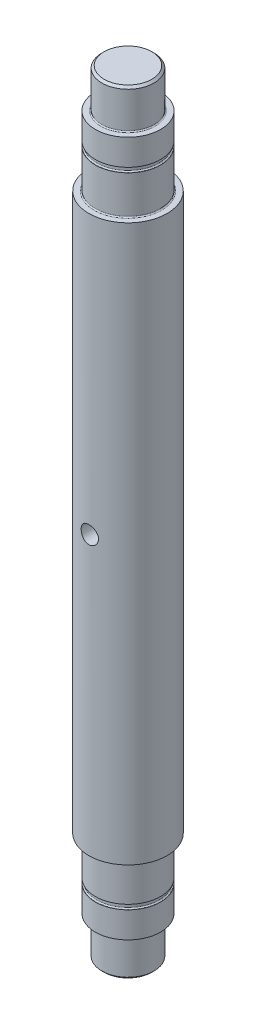
ISO-10303-21;
HEADER;
FILE_DESCRIPTION(('STEP AP214'),'2;1');
FILE_NAME('part.step','',(''),(''),'','','');
FILE_SCHEMA(('AUTOMOTIVE_DESIGN { 1 0 10303 214 1 1 1 1 }'));
ENDSEC;
DATA;
#1=APPLICATION_CONTEXT('core data for automotive mechanical design processes');
#2=APPLICATION_PROTOCOL_DEFINITION('international standard','automotive_design',2000,#1);
#3=PRODUCT_CONTEXT('',#1,'mechanical');
#4=PRODUCT('Part','Part','',(#3));
#5=PRODUCT_RELATED_PRODUCT_CATEGORY('part','',(#4));
#6=PRODUCT_DEFINITION_FORMATION('','',#4);
#7=PRODUCT_DEFINITION_CONTEXT('part definition',#1,'design');
#8=PRODUCT_DEFINITION('design','',#6,#7);
#9=PRODUCT_DEFINITION_SHAPE('','',#8);
#10=(LENGTH_UNIT() NAMED_UNIT(*) SI_UNIT(.MILLI.,.METRE.));
#11=(NAMED_UNIT(*) PLANE_ANGLE_UNIT() SI_UNIT($,.RADIAN.));
#12=(NAMED_UNIT(*) SI_UNIT($,.STERADIAN.) SOLID_ANGLE_UNIT());
#13=UNCERTAINTY_MEASURE_WITH_UNIT(LENGTH_MEASURE(1.E-05),#10,'distance_accuracy_value','');
#14=(GEOMETRIC_REPRESENTATION_CONTEXT(3) GLOBAL_UNCERTAINTY_ASSIGNED_CONTEXT((#13)) GLOBAL_UNIT_ASSIGNED_CONTEXT((#10,
#11,#12)) REPRESENTATION_CONTEXT('',''));
#15=CARTESIAN_POINT('',(0.,0.,0.));
#16=DIRECTION('',(0.,0.,1.));
#17=DIRECTION('',(1.,0.,0.));
#18=AXIS2_PLACEMENT_3D('',#15,#16,#17);
#19=CARTESIAN_POINT('',(0.,89.,0.));
#20=DIRECTION('',(0.,-1.,0.));
#21=DIRECTION('',(0.,0.,-1.));
#22=AXIS2_PLACEMENT_3D('',#19,#20,#21);
#23=PLANE('',#22);
#24=CARTESIAN_POINT('',(0.,89.,0.));
#25=DIRECTION('',(0.,-1.,0.));
#26=DIRECTION('',(0.,0.,-1.));
#27=AXIS2_PLACEMENT_3D('',#24,#25,#26);
#28=CIRCLE('',#27,5.50000000000003);
#29=CARTESIAN_POINT('',(0.,89.,-5.50000000000003));
#30=VERTEX_POINT('',#29);
#31=EDGE_CURVE('E66',#30,#30,#28,.F.);
#32=ORIENTED_EDGE('',*,*,#31,.T.);
#33=EDGE_LOOP('',(#32));
#34=FACE_BOUND('',#33,.T.);
#35=ADVANCED_FACE('F47',(#34),#23,.F.);
#36=CARTESIAN_POINT('',(0.,63.2572859494093,0.));
#37=DIRECTION('',(0.,1.,0.));
#38=DIRECTION('',(0.,0.,1.));
#39=AXIS2_PLACEMENT_3D('',#36,#37,#38);
#40=CYLINDRICAL_SURFACE('',#39,6.);
#41=CARTESIAN_POINT('',(0.,88.5,0.));
#42=DIRECTION('',(0.,-1.,0.));
#43=DIRECTION('',(0.,0.,-1.));
#44=AXIS2_PLACEMENT_3D('',#41,#42,#43);
#45=CIRCLE('',#44,6.);
#46=CARTESIAN_POINT('',(0.,88.5,-6.));
#47=VERTEX_POINT('',#46);
#48=EDGE_CURVE('E61',#47,#47,#45,.T.);
#49=ORIENTED_EDGE('',*,*,#48,.T.);
#50=EDGE_LOOP('',(#49));
#51=FACE_BOUND('',#50,.T.);
#52=CARTESIAN_POINT('',(0.,80.25,0.));
#53=DIRECTION('',(0.,-1.,0.));
#54=DIRECTION('',(0.,0.,-1.));
#55=AXIS2_PLACEMENT_3D('',#52,#53,#54);
#56=CIRCLE('',#55,6.);
#57=CARTESIAN_POINT('',(0.,80.25,-6.));
#58=VERTEX_POINT('',#57);
#59=EDGE_CURVE('E100',#58,#58,#56,.F.);
#60=ORIENTED_EDGE('',*,*,#59,.T.);
#61=EDGE_LOOP('',(#60));
#62=FACE_BOUND('',#61,.T.);
#63=ADVANCED_FACE('F201',(#51,#62),#40,.T.);
#64=CARTESIAN_POINT('',(6.,80.,0.));
#65=DIRECTION('',(0.,-1.,0.));
#66=DIRECTION('',(0.,0.,-1.));
#67=AXIS2_PLACEMENT_3D('',#64,#65,#66);
#68=PLANE('',#67);
#69=CARTESIAN_POINT('',(0.,80.,0.));
#70=DIRECTION('',(0.,-1.,0.));
#71=DIRECTION('',(0.,0.,-1.));
#72=AXIS2_PLACEMENT_3D('',#69,#70,#71);
#73=CIRCLE('',#72,6.25);
#74=CARTESIAN_POINT('',(0.,80.,-6.25));
#75=VERTEX_POINT('',#74);
#76=EDGE_CURVE('E96',#75,#75,#73,.T.);
#77=ORIENTED_EDGE('',*,*,#76,.T.);
#78=EDGE_LOOP('',(#77));
#79=FACE_BOUND('',#78,.T.);
#80=CARTESIAN_POINT('',(0.,80.,0.));
#81=DIRECTION('',(0.,1.,0.));
#82=DIRECTION('',(0.,0.,1.));
#83=AXIS2_PLACEMENT_3D('',#80,#81,#82);
#84=CIRCLE('',#83,7.49999999999998);
#85=CARTESIAN_POINT('',(0.,80.,7.49999999999998));
#86=VERTEX_POINT('',#85);
#87=EDGE_CURVE('E466',#86,#86,#84,.T.);
#88=ORIENTED_EDGE('',*,*,#87,.T.);
#89=EDGE_LOOP('',(#88));
#90=FACE_BOUND('',#89,.T.);
#91=ADVANCED_FACE('F208',(#79,#90),#68,.F.);
#92=CARTESIAN_POINT('',(0.,63.2572859494093,0.));
#93=DIRECTION('',(0.,1.,0.));
#94=DIRECTION('',(0.,0.,1.));
#95=AXIS2_PLACEMENT_3D('',#92,#93,#94);
#96=CYLINDRICAL_SURFACE('',#95,7.49999999999998);
#97=ORIENTED_EDGE('',*,*,#87,.F.);
#98=EDGE_LOOP('',(#97));
#99=FACE_BOUND('',#98,.T.);
#100=CARTESIAN_POINT('',(0.,74.,0.));
#101=DIRECTION('',(0.,1.,0.));
#102=DIRECTION('',(0.,0.,1.));
#103=AXIS2_PLACEMENT_3D('',#100,#101,#102);
#104=CIRCLE('',#103,7.49999999999998);
#105=CARTESIAN_POINT('',(0.,74.,7.49999999999998));
#106=VERTEX_POINT('',#105);
#107=EDGE_CURVE('E468',#106,#106,#104,.T.);
#108=ORIENTED_EDGE('',*,*,#107,.T.);
#109=EDGE_LOOP('',(#108));
#110=FACE_BOUND('',#109,.T.);
#111=ADVANCED_FACE('F395',(#99,#110),#96,.T.);
#112=CARTESIAN_POINT('',(7.49999999999998,74.,0.));
#113=DIRECTION('',(0.,1.,0.));
#114=DIRECTION('',(0.,0.,1.));
#115=AXIS2_PLACEMENT_3D('',#112,#113,#114);
#116=PLANE('',#115);
#117=CARTESIAN_POINT('',(0.,74.,0.));
#118=DIRECTION('',(0.,1.,0.));
#119=DIRECTION('',(0.,0.,1.));
#120=AXIS2_PLACEMENT_3D('',#117,#118,#119);
#121=CIRCLE('',#120,7.4);
#122=CARTESIAN_POINT('',(0.,74.,7.4));
#123=VERTEX_POINT('',#122);
#124=EDGE_CURVE('E104',#123,#123,#121,.T.);
#125=ORIENTED_EDGE('',*,*,#124,.T.);
#126=EDGE_LOOP('',(#125));
#127=FACE_BOUND('',#126,.T.);
#128=ORIENTED_EDGE('',*,*,#107,.F.);
#129=EDGE_LOOP('',(#128));
#130=FACE_BOUND('',#129,.T.);
#131=ADVANCED_FACE('F385',(#127,#130),#116,.F.);
#132=CARTESIAN_POINT('',(0.,63.2572859494093,0.));
#133=DIRECTION('',(0.,1.,0.));
#134=DIRECTION('',(0.,0.,1.));
#135=AXIS2_PLACEMENT_3D('',#132,#133,#134);
#136=CYLINDRICAL_SURFACE('',#135,7.15);
#137=CARTESIAN_POINT('',(0.,73.15,0.));
#138=DIRECTION('',(0.,-1.,0.));
#139=DIRECTION('',(0.,0.,-1.));
#140=AXIS2_PLACEMENT_3D('',#137,#138,#139);
#141=CIRCLE('',#140,7.15);
#142=CARTESIAN_POINT('',(0.,73.15,-7.15));
#143=VERTEX_POINT('',#142);
#144=EDGE_CURVE('E112',#143,#143,#141,.F.);
#145=ORIENTED_EDGE('',*,*,#144,.T.);
#146=EDGE_LOOP('',(#145));
#147=FACE_BOUND('',#146,.T.);
#148=CARTESIAN_POINT('',(0.,73.75,0.));
#149=DIRECTION('',(0.,1.,0.));
#150=DIRECTION('',(0.,0.,1.));
#151=AXIS2_PLACEMENT_3D('',#148,#149,#150);
#152=CIRCLE('',#151,7.15);
#153=CARTESIAN_POINT('',(0.,73.75,7.15));
#154=VERTEX_POINT('',#153);
#155=EDGE_CURVE('E116',#154,#154,#152,.F.);
#156=ORIENTED_EDGE('',*,*,#155,.T.);
#157=EDGE_LOOP('',(#156));
#158=FACE_BOUND('',#157,.T.);
#159=ADVANCED_FACE('F375',(#147,#158),#136,.T.);
#160=CARTESIAN_POINT('',(7.15,72.9,0.));
#161=DIRECTION('',(0.,-1.,0.));
#162=DIRECTION('',(0.,0.,-1.));
#163=AXIS2_PLACEMENT_3D('',#160,#161,#162);
#164=PLANE('',#163);
#165=CARTESIAN_POINT('',(0.,72.9,0.));
#166=DIRECTION('',(0.,-1.,0.));
#167=DIRECTION('',(0.,0.,-1.));
#168=AXIS2_PLACEMENT_3D('',#165,#166,#167);
#169=CIRCLE('',#168,7.4);
#170=CARTESIAN_POINT('',(0.,72.9,-7.4));
#171=VERTEX_POINT('',#170);
#172=EDGE_CURVE('E108',#171,#171,#169,.T.);
#173=ORIENTED_EDGE('',*,*,#172,.T.);
#174=EDGE_LOOP('',(#173));
#175=FACE_BOUND('',#174,.T.);
#176=CARTESIAN_POINT('',(0.,72.9,0.));
#177=DIRECTION('',(0.,1.,0.));
#178=DIRECTION('',(0.,0.,1.));
#179=AXIS2_PLACEMENT_3D('',#176,#177,#178);
#180=CIRCLE('',#179,7.49999999999998);
#181=CARTESIAN_POINT('',(0.,72.9,7.49999999999998));
#182=VERTEX_POINT('',#181);
#183=EDGE_CURVE('E473',#182,#182,#180,.T.);
#184=ORIENTED_EDGE('',*,*,#183,.T.);
#185=EDGE_LOOP('',(#184));
#186=FACE_BOUND('',#185,.T.);
#187=ADVANCED_FACE('F365',(#175,#186),#164,.F.);
#188=CARTESIAN_POINT('',(0.,63.2572859494093,0.));
#189=DIRECTION('',(0.,1.,0.));
#190=DIRECTION('',(0.,0.,1.));
#191=AXIS2_PLACEMENT_3D('',#188,#189,#190);
#192=CYLINDRICAL_SURFACE('',#191,7.49999999999999);
#193=CARTESIAN_POINT('',(0.,64.25,0.));
#194=DIRECTION('',(0.,-1.,0.));
#195=DIRECTION('',(0.,0.,-1.));
#196=AXIS2_PLACEMENT_3D('',#193,#194,#195);
#197=CIRCLE('',#196,7.49999999999999);
#198=CARTESIAN_POINT('',(0.,64.25,-7.49999999999999));
#199=VERTEX_POINT('',#198);
#200=EDGE_CURVE('E76',#199,#199,#197,.F.);
#201=ORIENTED_EDGE('',*,*,#200,.T.);
#202=EDGE_LOOP('',(#201));
#203=FACE_BOUND('',#202,.T.);
#204=ORIENTED_EDGE('',*,*,#183,.F.);
#205=EDGE_LOOP('',(#204));
#206=FACE_BOUND('',#205,.T.);
#207=ADVANCED_FACE('F356',(#203,#206),#192,.T.);
#208=CARTESIAN_POINT('',(7.5,64.,0.));
#209=DIRECTION('',(0.,-1.,0.));
#210=DIRECTION('',(0.,0.,-1.));
#211=AXIS2_PLACEMENT_3D('',#208,#209,#210);
#212=PLANE('',#211);
#213=CARTESIAN_POINT('',(0.,64.,0.));
#214=DIRECTION('',(0.,-1.,0.));
#215=DIRECTION('',(0.,0.,-1.));
#216=AXIS2_PLACEMENT_3D('',#213,#214,#215);
#217=CIRCLE('',#216,7.74999999999999);
#218=CARTESIAN_POINT('',(0.,64.,-7.74999999999999));
#219=VERTEX_POINT('',#218);
#220=EDGE_CURVE('E72',#219,#219,#217,.T.);
#221=ORIENTED_EDGE('',*,*,#220,.T.);
#222=EDGE_LOOP('',(#221));
#223=FACE_BOUND('',#222,.T.);
#224=CARTESIAN_POINT('',(0.,64.,0.));
#225=DIRECTION('',(0.,1.,0.));
#226=DIRECTION('',(0.,0.,1.));
#227=AXIS2_PLACEMENT_3D('',#224,#225,#226);
#228=CIRCLE('',#227,9.00000000000001);
#229=CARTESIAN_POINT('',(0.,64.,9.00000000000001));
#230=VERTEX_POINT('',#229);
#231=EDGE_CURVE('E479',#230,#230,#228,.T.);
#232=ORIENTED_EDGE('',*,*,#231,.T.);
#233=EDGE_LOOP('',(#232));
#234=FACE_BOUND('',#233,.T.);
#235=ADVANCED_FACE('F197',(#223,#234),#212,.F.);
#236=CARTESIAN_POINT('',(0.,63.2572859494093,0.));
#237=DIRECTION('',(0.,1.,0.));
#238=DIRECTION('',(0.,0.,1.));
#239=AXIS2_PLACEMENT_3D('',#236,#237,#238);
#240=CYLINDRICAL_SURFACE('',#239,9.00000000000001);
#241=CARTESIAN_POINT('',(0.,2.,-9.00000000000001));
#242=CARTESIAN_POINT('',(-0.110880476775648,1.99999627632018,-8.99999796218253));
#243=CARTESIAN_POINT('',(-0.22180556526962,1.99074801833651,-8.99793013995693));
#244=CARTESIAN_POINT('',(-0.440501944103134,1.95403952764945,-8.98988097757671));
#245=CARTESIAN_POINT('',(-0.548270975138988,1.92656656599072,-8.9838969021735));
#246=CARTESIAN_POINT('',(-0.757463277761529,1.85431402950835,-8.9686811316901));
#247=CARTESIAN_POINT('',(-0.858893152100285,1.80955282300213,-8.95945288439084));
#248=CARTESIAN_POINT('',(-1.05280018031376,1.7040533875276,-8.93874335441379));
#249=CARTESIAN_POINT('',(-1.14527750793335,1.64331546870939,-8.9272621154736));
#250=CARTESIAN_POINT('',(-1.32018631401404,1.50652433489332,-8.90309094174212));
#251=CARTESIAN_POINT('',(-1.40244861204354,1.43025749786486,-8.89038561641429));
#252=CARTESIAN_POINT('',(-1.55312491045837,1.26503193990686,-8.86530601079789));
#253=CARTESIAN_POINT('',(-1.62153764410855,1.17607205928954,-8.8529317608805));
#254=CARTESIAN_POINT('',(-1.74332443410351,0.986728155941701,-8.82976328261713));
#255=CARTESIAN_POINT('',(-1.79651742104404,0.88622504195847,-8.81898875742983));
#256=CARTESIAN_POINT('',(-1.88519298954508,0.677427238307579,-8.80046096352397));
#257=CARTESIAN_POINT('',(-1.92067776220096,0.569133514495746,-8.79270732104773));
#258=CARTESIAN_POINT('',(-1.97236858006404,0.349666522677334,-8.7812560945919));
#259=CARTESIAN_POINT('',(-1.98887467038069,0.238567284894573,-8.77749545807785));
#260=CARTESIAN_POINT('',(-2.00307270997673,0.0151177822137991,-8.77426673730671));
#261=CARTESIAN_POINT('',(-2.00076704911663,-0.0972323219621482,-8.7747981077894));
#262=CARTESIAN_POINT('',(-1.97764827517302,-0.317756627193804,-8.78003632148147));
#263=CARTESIAN_POINT('',(-1.95718464460217,-0.425969624139347,-8.78466431384842));
#264=CARTESIAN_POINT('',(-1.89888490681146,-0.637387143325004,-8.79744954191677));
#265=CARTESIAN_POINT('',(-1.86104779681652,-0.740591376085401,-8.80560698133178));
#266=CARTESIAN_POINT('',(-1.76875672872875,-0.940039438381883,-8.82460909970298));
#267=CARTESIAN_POINT('',(-1.71416919379353,-1.03621932733607,-8.83547524362491));
#268=CARTESIAN_POINT('',(-1.5900206813985,-1.21818287051589,-8.85865737910745));
#269=CARTESIAN_POINT('',(-1.52045760074274,-1.30396506182015,-8.87097357420598));
#270=CARTESIAN_POINT('',(-1.36648683702983,-1.46470930934847,-8.89600574612667));
#271=CARTESIAN_POINT('',(-1.28178220526623,-1.53938678510506,-8.90872450687873));
#272=CARTESIAN_POINT('',(-1.10090661809162,-1.67352372890712,-8.93287839122319));
#273=CARTESIAN_POINT('',(-1.00473544183737,-1.7329829037819,-8.94431349008428));
#274=CARTESIAN_POINT('',(-0.803303190734734,-1.83506927577681,-8.96465064233609));
#275=CARTESIAN_POINT('',(-0.698022122319853,-1.87765824430826,-8.97354693007661));
#276=CARTESIAN_POINT('',(-0.481555930981455,-1.94446101305787,-8.98776136366256));
#277=CARTESIAN_POINT('',(-0.370371697593364,-1.96867757341413,-8.99308004696787));
#278=CARTESIAN_POINT('',(-0.147695483280843,-1.99763201325517,-8.99946317761674));
#279=CARTESIAN_POINT('',(-0.0362563973189034,-2.00275850016168,-9.00061248622291));
#280=CARTESIAN_POINT('',(0.185885923928081,-1.99444189573963,-8.99876558650599));
#281=CARTESIAN_POINT('',(0.296589210270647,-1.98100010668056,-8.99576966890461));
#282=CARTESIAN_POINT('',(0.512823257329423,-1.9362505848319,-8.98602258758615));
#283=CARTESIAN_POINT('',(0.618398491715485,-1.90514754377655,-8.97931447007763));
#284=CARTESIAN_POINT('',(0.822832805855833,-1.82618631255493,-8.96289421086797));
#285=CARTESIAN_POINT('',(0.92169130001018,-1.778326663694,-8.95318180764661));
#286=CARTESIAN_POINT('',(1.11148643989438,-1.66640712320102,-8.93162153227641));
#287=CARTESIAN_POINT('',(1.20228573083225,-1.60212005699384,-8.91974444590249));
#288=CARTESIAN_POINT('',(1.37194696498812,-1.45946875089856,-8.89523032349081));
#289=CARTESIAN_POINT('',(1.45080730173413,-1.3811026196679,-8.88259318550176));
#290=CARTESIAN_POINT('',(1.59589548190986,-1.2107319664193,-8.85768878945812));
#291=CARTESIAN_POINT('',(1.66185381940073,-1.1184959099934,-8.84543317664286));
#292=CARTESIAN_POINT('',(1.77734611922752,-0.924027965589187,-8.8229539537831));
#293=CARTESIAN_POINT('',(1.82688079926974,-0.821796514657904,-8.81273025495272));
#294=CARTESIAN_POINT('',(1.90778001896259,-0.610791710894864,-8.79557200548927));
#295=CARTESIAN_POINT('',(1.93924786354759,-0.502059557731162,-8.78861879659788));
#296=CARTESIAN_POINT('',(1.98342027658406,-0.280675815137526,-8.77875649697393));
#297=CARTESIAN_POINT('',(1.99612795718356,-0.168024878974045,-8.77584673547333));
#298=CARTESIAN_POINT('',(2.00228356641044,0.0552788782783302,-8.77444401448979));
#299=CARTESIAN_POINT('',(1.99615913143934,0.165919508060063,-8.77585298370125));
#300=CARTESIAN_POINT('',(1.96578277121688,0.384549709966822,-8.78270664957549));
#301=CARTESIAN_POINT('',(1.9415310740024,0.492539315423486,-8.78815129547035));
#302=CARTESIAN_POINT('',(1.87579819980745,0.70244912022738,-8.80241428131526));
#303=CARTESIAN_POINT('',(1.83438116628454,0.804390316881597,-8.81122005182771));
#304=CARTESIAN_POINT('',(1.73554770348342,0.999939992546728,-8.83121764469059));
#305=CARTESIAN_POINT('',(1.67812954585194,1.09354756996401,-8.84240972476634));
#306=CARTESIAN_POINT('',(1.54751358990558,1.27187660894797,-8.86621042835331));
#307=CARTESIAN_POINT('',(1.47401185511038,1.35637220492265,-8.87884371367742));
#308=CARTESIAN_POINT('',(1.31392870594504,1.51197007393133,-8.90393974173389));
#309=CARTESIAN_POINT('',(1.22734426623343,1.58306924050842,-8.91640244429054));
#310=CARTESIAN_POINT('',(1.04214597064557,1.71077598291992,-8.93995259726583));
#311=CARTESIAN_POINT('',(0.943385636634949,1.76717519973493,-8.9510192349923));
#312=CARTESIAN_POINT('',(0.737560279778818,1.86248330418121,-8.97032058369251));
#313=CARTESIAN_POINT('',(0.630502203312994,1.90140664004617,-8.97855763270817));
#314=CARTESIAN_POINT('',(0.436138247729408,1.95384135027679,-8.98982812909556));
#315=CARTESIAN_POINT('',(0.349871991901682,1.97111737366629,-8.99361869023212));
#316=CARTESIAN_POINT('',(0.175746449894528,1.99419790430616,-8.9987053745979));
#317=CARTESIAN_POINT('',(0.0878872388928782,2.00000295150191,-9.00000161523614));
#318=CARTESIAN_POINT('',(0.,2.,-9.00000000000001));
#319=B_SPLINE_CURVE_WITH_KNOTS('',3,(#241,#242,#243,#244,#245,#246,#247,#248,#249,#250,#251,
#252,#253,#254,#255,#256,#257,#258,#259,#260,#261,#262,#263,#264,#265,#266,#267,#268,#269,#270,
#271,#272,#273,#274,#275,#276,#277,#278,#279,#280,#281,#282,#283,#284,#285,#286,#287,#288,#289,
#290,#291,#292,#293,#294,#295,#296,#297,#298,#299,#300,#301,#302,#303,#304,#305,#306,#307,#308,
#309,#310,#311,#312,#313,#314,#315,#316,#317,#318),.UNSPECIFIED.,.T.,.F.,(4,2,2,2,2,2,2,2,2,2,2,
2,2,2,2,2,2,2,2,2,2,2,2,2,2,2,2,2,2,2,2,2,2,2,2,2,2,2,4),(0.,0.332319689729797,
0.664871731249284,0.99707141240746,1.32926464516989,1.66638072002079,2.00352761490514,
2.34453296297976,2.6854961068774,3.02099125638107,3.35644378496591,3.68557668145784,
4.0147285774694,4.34657669709582,4.678471452583,5.01778179808977,5.35709867969828,
5.69718012811238,6.03721047501988,6.37027992124269,6.70332600912268,7.03258869425168,
7.3618800494546,7.69599803262042,8.03016093387757,8.37069473105729,8.71121364510412,
9.04976559055244,9.38826136686412,9.71912785142417,10.0499901738286,10.3796271201578,
10.7092996858639,11.0458432631283,11.3824647846641,11.7236258704957,12.0645043787094,
12.3279234735856,12.5913301688795),.UNSPECIFIED.);
#320=CARTESIAN_POINT('',(0.,2.,-9.00000000000001));
#321=VERTEX_POINT('',#320);
#322=EDGE_CURVE('E136',#321,#321,#319,.T.);
#323=ORIENTED_EDGE('',*,*,#322,.T.);
#324=EDGE_LOOP('',(#323));
#325=FACE_BOUND('',#324,.T.);
#326=CARTESIAN_POINT('',(0.,-2.,9.00000000000001));
#327=CARTESIAN_POINT('',(-0.110880476775648,-1.99999627632018,8.99999796218253));
#328=CARTESIAN_POINT('',(-0.22180556526962,-1.99074801833651,8.99793013995693));
#329=CARTESIAN_POINT('',(-0.440501944103134,-1.95403952764945,8.98988097757671));
#330=CARTESIAN_POINT('',(-0.548270975138988,-1.92656656599072,8.9838969021735));
#331=CARTESIAN_POINT('',(-0.757463277761529,-1.85431402950835,8.9686811316901));
#332=CARTESIAN_POINT('',(-0.858893152100285,-1.80955282300213,8.95945288439084));
#333=CARTESIAN_POINT('',(-1.05280018031376,-1.7040533875276,8.93874335441379));
#334=CARTESIAN_POINT('',(-1.14527750793335,-1.64331546870939,8.9272621154736));
#335=CARTESIAN_POINT('',(-1.32018631401404,-1.50652433489332,8.90309094174212));
#336=CARTESIAN_POINT('',(-1.40244861204354,-1.43025749786486,8.89038561641429));
#337=CARTESIAN_POINT('',(-1.55312491045837,-1.26503193990686,8.86530601079789));
#338=CARTESIAN_POINT('',(-1.62153764410855,-1.17607205928954,8.8529317608805));
#339=CARTESIAN_POINT('',(-1.74332443410351,-0.986728155941701,8.82976328261713));
#340=CARTESIAN_POINT('',(-1.79651742104404,-0.88622504195847,8.81898875742983));
#341=CARTESIAN_POINT('',(-1.88519298954508,-0.677427238307579,8.80046096352397));
#342=CARTESIAN_POINT('',(-1.92067776220096,-0.569133514495746,8.79270732104773));
#343=CARTESIAN_POINT('',(-1.97236858006404,-0.349666522677334,8.7812560945919));
#344=CARTESIAN_POINT('',(-1.98887467038069,-0.238567284894573,8.77749545807785));
#345=CARTESIAN_POINT('',(-2.00307270997673,-0.0151177822137991,8.77426673730671));
#346=CARTESIAN_POINT('',(-2.00076704911663,0.0972323219621482,8.7747981077894));
#347=CARTESIAN_POINT('',(-1.97764827517302,0.317756627193804,8.78003632148147));
#348=CARTESIAN_POINT('',(-1.95718464460217,0.425969624139347,8.78466431384842));
#349=CARTESIAN_POINT('',(-1.89888490681146,0.637387143325004,8.79744954191677));
#350=CARTESIAN_POINT('',(-1.86104779681652,0.740591376085401,8.80560698133178));
#351=CARTESIAN_POINT('',(-1.76875672872875,0.940039438381883,8.82460909970298));
#352=CARTESIAN_POINT('',(-1.71416919379353,1.03621932733607,8.83547524362491));
#353=CARTESIAN_POINT('',(-1.5900206813985,1.21818287051589,8.85865737910745));
#354=CARTESIAN_POINT('',(-1.52045760074274,1.30396506182015,8.87097357420598));
#355=CARTESIAN_POINT('',(-1.36648683702983,1.46470930934847,8.89600574612667));
#356=CARTESIAN_POINT('',(-1.28178220526623,1.53938678510506,8.90872450687873));
#357=CARTESIAN_POINT('',(-1.10090661809162,1.67352372890712,8.93287839122319));
#358=CARTESIAN_POINT('',(-1.00473544183737,1.7329829037819,8.94431349008428));
#359=CARTESIAN_POINT('',(-0.803303190734734,1.83506927577681,8.96465064233609));
#360=CARTESIAN_POINT('',(-0.698022122319853,1.87765824430826,8.97354693007661));
#361=CARTESIAN_POINT('',(-0.481555930981455,1.94446101305787,8.98776136366256));
#362=CARTESIAN_POINT('',(-0.370371697593364,1.96867757341413,8.99308004696787));
#363=CARTESIAN_POINT('',(-0.147695483280843,1.99763201325517,8.99946317761674));
#364=CARTESIAN_POINT('',(-0.0362563973189034,2.00275850016168,9.00061248622291));
#365=CARTESIAN_POINT('',(0.185885923928081,1.99444189573963,8.99876558650599));
#366=CARTESIAN_POINT('',(0.296589210270647,1.98100010668056,8.99576966890461));
#367=CARTESIAN_POINT('',(0.512823257329423,1.9362505848319,8.98602258758615));
#368=CARTESIAN_POINT('',(0.618398491715485,1.90514754377655,8.97931447007763));
#369=CARTESIAN_POINT('',(0.822832805855833,1.82618631255493,8.96289421086797));
#370=CARTESIAN_POINT('',(0.92169130001018,1.778326663694,8.95318180764661));
#371=CARTESIAN_POINT('',(1.11148643989438,1.66640712320102,8.93162153227641));
#372=CARTESIAN_POINT('',(1.20228573083225,1.60212005699384,8.91974444590249));
#373=CARTESIAN_POINT('',(1.37194696498812,1.45946875089856,8.89523032349081));
#374=CARTESIAN_POINT('',(1.45080730173413,1.3811026196679,8.88259318550176));
#375=CARTESIAN_POINT('',(1.59589548190986,1.2107319664193,8.85768878945812));
#376=CARTESIAN_POINT('',(1.66185381940073,1.1184959099934,8.84543317664286));
#377=CARTESIAN_POINT('',(1.77734611922752,0.924027965589187,8.8229539537831));
#378=CARTESIAN_POINT('',(1.82688079926974,0.821796514657904,8.81273025495272));
#379=CARTESIAN_POINT('',(1.90778001896259,0.610791710894864,8.79557200548927));
#380=CARTESIAN_POINT('',(1.93924786354759,0.502059557731162,8.78861879659788));
#381=CARTESIAN_POINT('',(1.98342027658406,0.280675815137526,8.77875649697393));
#382=CARTESIAN_POINT('',(1.99612795718356,0.168024878974045,8.77584673547333));
#383=CARTESIAN_POINT('',(2.00228356641044,-0.0552788782783302,8.77444401448979));
#384=CARTESIAN_POINT('',(1.99615913143934,-0.165919508060063,8.77585298370125));
#385=CARTESIAN_POINT('',(1.96578277121688,-0.384549709966822,8.78270664957549));
#386=CARTESIAN_POINT('',(1.9415310740024,-0.492539315423486,8.78815129547035));
#387=CARTESIAN_POINT('',(1.87579819980745,-0.70244912022738,8.80241428131526));
#388=CARTESIAN_POINT('',(1.83438116628454,-0.804390316881597,8.81122005182771));
#389=CARTESIAN_POINT('',(1.73554770348342,-0.999939992546728,8.83121764469059));
#390=CARTESIAN_POINT('',(1.67812954585194,-1.09354756996401,8.84240972476634));
#391=CARTESIAN_POINT('',(1.54751358990558,-1.27187660894797,8.86621042835331));
#392=CARTESIAN_POINT('',(1.47401185511038,-1.35637220492265,8.87884371367742));
#393=CARTESIAN_POINT('',(1.31392870594504,-1.51197007393133,8.90393974173389));
#394=CARTESIAN_POINT('',(1.22734426623343,-1.58306924050842,8.91640244429054));
#395=CARTESIAN_POINT('',(1.04214597064557,-1.71077598291992,8.93995259726583));
#396=CARTESIAN_POINT('',(0.943385636634949,-1.76717519973493,8.9510192349923));
#397=CARTESIAN_POINT('',(0.737560279778818,-1.86248330418121,8.97032058369251));
#398=CARTESIAN_POINT('',(0.630502203312994,-1.90140664004617,8.97855763270817));
#399=CARTESIAN_POINT('',(0.436138247729408,-1.95384135027679,8.98982812909556));
#400=CARTESIAN_POINT('',(0.349871991901682,-1.97111737366629,8.99361869023212));
#401=CARTESIAN_POINT('',(0.175746449894528,-1.99419790430616,8.9987053745979));
#402=CARTESIAN_POINT('',(0.0878872388928782,-2.00000295150191,9.00000161523614));
#403=CARTESIAN_POINT('',(0.,-2.,9.00000000000001));
#404=B_SPLINE_CURVE_WITH_KNOTS('',3,(#326,#327,#328,#329,#330,#331,#332,#333,#334,#335,#336,
#337,#338,#339,#340,#341,#342,#343,#344,#345,#346,#347,#348,#349,#350,#351,#352,#353,#354,#355,
#356,#357,#358,#359,#360,#361,#362,#363,#364,#365,#366,#367,#368,#369,#370,#371,#372,#373,#374,
#375,#376,#377,#378,#379,#380,#381,#382,#383,#384,#385,#386,#387,#388,#389,#390,#391,#392,#393,
#394,#395,#396,#397,#398,#399,#400,#401,#402,#403),.UNSPECIFIED.,.T.,.F.,(4,2,2,2,2,2,2,2,2,2,2,
2,2,2,2,2,2,2,2,2,2,2,2,2,2,2,2,2,2,2,2,2,2,2,2,2,2,2,4),(0.,0.332319689729797,
0.664871731249284,0.99707141240746,1.32926464516989,1.66638072002079,2.00352761490514,
2.34453296297976,2.6854961068774,3.02099125638107,3.35644378496591,3.68557668145784,
4.0147285774694,4.34657669709582,4.678471452583,5.01778179808977,5.35709867969828,
5.69718012811238,6.03721047501988,6.37027992124269,6.70332600912268,7.03258869425168,
7.3618800494546,7.69599803262042,8.03016093387757,8.37069473105729,8.71121364510412,
9.04976559055244,9.38826136686412,9.71912785142417,10.0499901738286,10.3796271201578,
10.7092996858639,11.0458432631283,11.3824647846641,11.7236258704957,12.0645043787094,
12.3279234735856,12.5913301688795),.UNSPECIFIED.);
#405=CARTESIAN_POINT('',(0.,-2.,9.00000000000001));
#406=VERTEX_POINT('',#405);
#407=EDGE_CURVE('E145',#406,#406,#404,.T.);
#408=ORIENTED_EDGE('',*,*,#407,.T.);
#409=EDGE_LOOP('',(#408));
#410=FACE_BOUND('',#409,.T.);
#411=ORIENTED_EDGE('',*,*,#231,.F.);
#412=EDGE_LOOP('',(#411));
#413=FACE_BOUND('',#412,.T.);
#414=CARTESIAN_POINT('',(0.,-64.,0.));
#415=DIRECTION('',(0.,1.,0.));
#416=DIRECTION('',(0.,0.,1.));
#417=AXIS2_PLACEMENT_3D('',#414,#415,#416);
#418=CIRCLE('',#417,9.00000000000001);
#419=CARTESIAN_POINT('',(0.,-64.,9.00000000000001));
#420=VERTEX_POINT('',#419);
#421=EDGE_CURVE('E483',#420,#420,#418,.T.);
#422=ORIENTED_EDGE('',*,*,#421,.T.);
#423=EDGE_LOOP('',(#422));
#424=FACE_BOUND('',#423,.T.);
#425=ADVANCED_FACE('F150',(#325,#410,#413,#424),#240,.T.);
#426=CARTESIAN_POINT('',(9.00000000000001,-64.,0.));
#427=DIRECTION('',(0.,1.,0.));
#428=DIRECTION('',(0.,0.,1.));
#429=AXIS2_PLACEMENT_3D('',#426,#427,#428);
#430=PLANE('',#429);
#431=CARTESIAN_POINT('',(0.,-64.,0.));
#432=DIRECTION('',(0.,1.,0.));
#433=DIRECTION('',(0.,0.,1.));
#434=AXIS2_PLACEMENT_3D('',#431,#432,#433);
#435=CIRCLE('',#434,7.75);
#436=CARTESIAN_POINT('',(0.,-64.,7.75));
#437=VERTEX_POINT('',#436);
#438=EDGE_CURVE('E92',#437,#437,#435,.T.);
#439=ORIENTED_EDGE('',*,*,#438,.T.);
#440=EDGE_LOOP('',(#439));
#441=FACE_BOUND('',#440,.T.);
#442=ORIENTED_EDGE('',*,*,#421,.F.);
#443=EDGE_LOOP('',(#442));
#444=FACE_BOUND('',#443,.T.);
#445=ADVANCED_FACE('F189',(#441,#444),#430,.F.);
#446=CARTESIAN_POINT('',(0.,63.2572859494093,0.));
#447=DIRECTION('',(0.,1.,0.));
#448=DIRECTION('',(0.,0.,1.));
#449=AXIS2_PLACEMENT_3D('',#446,#447,#448);
#450=CYLINDRICAL_SURFACE('',#449,7.5);
#451=CARTESIAN_POINT('',(0.,-64.25,0.));
#452=DIRECTION('',(0.,1.,0.));
#453=DIRECTION('',(0.,0.,1.));
#454=AXIS2_PLACEMENT_3D('',#451,#452,#453);
#455=CIRCLE('',#454,7.5);
#456=CARTESIAN_POINT('',(0.,-64.25,7.5));
#457=VERTEX_POINT('',#456);
#458=EDGE_CURVE('E88',#457,#457,#455,.F.);
#459=ORIENTED_EDGE('',*,*,#458,.T.);
#460=EDGE_LOOP('',(#459));
#461=FACE_BOUND('',#460,.T.);
#462=CARTESIAN_POINT('',(0.,-72.9,0.));
#463=DIRECTION('',(0.,1.,0.));
#464=DIRECTION('',(0.,0.,1.));
#465=AXIS2_PLACEMENT_3D('',#462,#463,#464);
#466=CIRCLE('',#465,7.5);
#467=CARTESIAN_POINT('',(0.,-72.9,7.5));
#468=VERTEX_POINT('',#467);
#469=EDGE_CURVE('E487',#468,#468,#466,.T.);
#470=ORIENTED_EDGE('',*,*,#469,.T.);
#471=EDGE_LOOP('',(#470));
#472=FACE_BOUND('',#471,.T.);
#473=ADVANCED_FACE('F186',(#461,#472),#450,.T.);
#474=CARTESIAN_POINT('',(7.5,-72.9,0.));
#475=DIRECTION('',(0.,1.,0.));
#476=DIRECTION('',(0.,0.,1.));
#477=AXIS2_PLACEMENT_3D('',#474,#475,#476);
#478=PLANE('',#477);
#479=CARTESIAN_POINT('',(0.,-72.9,0.));
#480=DIRECTION('',(0.,1.,0.));
#481=DIRECTION('',(0.,0.,1.));
#482=AXIS2_PLACEMENT_3D('',#479,#480,#481);
#483=CIRCLE('',#482,7.4);
#484=CARTESIAN_POINT('',(0.,-72.9,7.4));
#485=VERTEX_POINT('',#484);
#486=EDGE_CURVE('E120',#485,#485,#483,.T.);
#487=ORIENTED_EDGE('',*,*,#486,.T.);
#488=EDGE_LOOP('',(#487));
#489=FACE_BOUND('',#488,.T.);
#490=ORIENTED_EDGE('',*,*,#469,.F.);
#491=EDGE_LOOP('',(#490));
#492=FACE_BOUND('',#491,.T.);
#493=ADVANCED_FACE('F182',(#489,#492),#478,.F.);
#494=CARTESIAN_POINT('',(0.,63.2572859494093,0.));
#495=DIRECTION('',(0.,1.,0.));
#496=DIRECTION('',(0.,0.,1.));
#497=AXIS2_PLACEMENT_3D('',#494,#495,#496);
#498=CYLINDRICAL_SURFACE('',#497,7.15);
#499=CARTESIAN_POINT('',(0.,-73.75,0.));
#500=DIRECTION('',(0.,-1.,0.));
#501=DIRECTION('',(0.,0.,-1.));
#502=AXIS2_PLACEMENT_3D('',#499,#500,#501);
#503=CIRCLE('',#502,7.15);
#504=CARTESIAN_POINT('',(0.,-73.75,-7.15));
#505=VERTEX_POINT('',#504);
#506=EDGE_CURVE('E128',#505,#505,#503,.F.);
#507=ORIENTED_EDGE('',*,*,#506,.T.);
#508=EDGE_LOOP('',(#507));
#509=FACE_BOUND('',#508,.T.);
#510=CARTESIAN_POINT('',(0.,-73.15,0.));
#511=DIRECTION('',(0.,1.,0.));
#512=DIRECTION('',(0.,0.,1.));
#513=AXIS2_PLACEMENT_3D('',#510,#511,#512);
#514=CIRCLE('',#513,7.15);
#515=CARTESIAN_POINT('',(0.,-73.15,7.15));
#516=VERTEX_POINT('',#515);
#517=EDGE_CURVE('E132',#516,#516,#514,.F.);
#518=ORIENTED_EDGE('',*,*,#517,.T.);
#519=EDGE_LOOP('',(#518));
#520=FACE_BOUND('',#519,.T.);
#521=ADVANCED_FACE('F178',(#509,#520),#498,.T.);
#522=CARTESIAN_POINT('',(7.15,-74.,0.));
#523=DIRECTION('',(0.,-1.,0.));
#524=DIRECTION('',(0.,0.,-1.));
#525=AXIS2_PLACEMENT_3D('',#522,#523,#524);
#526=PLANE('',#525);
#527=CARTESIAN_POINT('',(0.,-74.,0.));
#528=DIRECTION('',(0.,-1.,0.));
#529=DIRECTION('',(0.,0.,-1.));
#530=AXIS2_PLACEMENT_3D('',#527,#528,#529);
#531=CIRCLE('',#530,7.4);
#532=CARTESIAN_POINT('',(0.,-74.,-7.4));
#533=VERTEX_POINT('',#532);
#534=EDGE_CURVE('E124',#533,#533,#531,.T.);
#535=ORIENTED_EDGE('',*,*,#534,.T.);
#536=EDGE_LOOP('',(#535));
#537=FACE_BOUND('',#536,.T.);
#538=CARTESIAN_POINT('',(0.,-74.,0.));
#539=DIRECTION('',(0.,1.,0.));
#540=DIRECTION('',(0.,0.,1.));
#541=AXIS2_PLACEMENT_3D('',#538,#539,#540);
#542=CIRCLE('',#541,7.5);
#543=CARTESIAN_POINT('',(0.,-74.,7.5));
#544=VERTEX_POINT('',#543);
#545=EDGE_CURVE('E491',#544,#544,#542,.T.);
#546=ORIENTED_EDGE('',*,*,#545,.T.);
#547=EDGE_LOOP('',(#546));
#548=FACE_BOUND('',#547,.T.);
#549=ADVANCED_FACE('F174',(#537,#548),#526,.F.);
#550=CARTESIAN_POINT('',(0.,63.2572859494093,0.));
#551=DIRECTION('',(0.,1.,0.));
#552=DIRECTION('',(0.,0.,1.));
#553=AXIS2_PLACEMENT_3D('',#550,#551,#552);
#554=CYLINDRICAL_SURFACE('',#553,7.5);
#555=ORIENTED_EDGE('',*,*,#545,.F.);
#556=EDGE_LOOP('',(#555));
#557=FACE_BOUND('',#556,.T.);
#558=CARTESIAN_POINT('',(0.,-80.,0.));
#559=DIRECTION('',(0.,1.,0.));
#560=DIRECTION('',(0.,0.,1.));
#561=AXIS2_PLACEMENT_3D('',#558,#559,#560);
#562=CIRCLE('',#561,7.5);
#563=CARTESIAN_POINT('',(0.,-80.,7.5));
#564=VERTEX_POINT('',#563);
#565=EDGE_CURVE('E495',#564,#564,#562,.T.);
#566=ORIENTED_EDGE('',*,*,#565,.T.);
#567=EDGE_LOOP('',(#566));
#568=FACE_BOUND('',#567,.T.);
#569=ADVANCED_FACE('F170',(#557,#568),#554,.T.);
#570=CARTESIAN_POINT('',(7.5,-80.,0.));
#571=DIRECTION('',(0.,1.,0.));
#572=DIRECTION('',(0.,0.,1.));
#573=AXIS2_PLACEMENT_3D('',#570,#571,#572);
#574=PLANE('',#573);
#575=CARTESIAN_POINT('',(0.,-80.,0.));
#576=DIRECTION('',(0.,1.,0.));
#577=DIRECTION('',(0.,0.,1.));
#578=AXIS2_PLACEMENT_3D('',#575,#576,#577);
#579=CIRCLE('',#578,6.25000000000002);
#580=CARTESIAN_POINT('',(0.,-80.,6.25000000000002));
#581=VERTEX_POINT('',#580);
#582=EDGE_CURVE('E84',#581,#581,#579,.T.);
#583=ORIENTED_EDGE('',*,*,#582,.T.);
#584=EDGE_LOOP('',(#583));
#585=FACE_BOUND('',#584,.T.);
#586=ORIENTED_EDGE('',*,*,#565,.F.);
#587=EDGE_LOOP('',(#586));
#588=FACE_BOUND('',#587,.T.);
#589=ADVANCED_FACE('F167',(#585,#588),#574,.F.);
#590=CARTESIAN_POINT('',(0.,63.2572859494093,0.));
#591=DIRECTION('',(0.,1.,0.));
#592=DIRECTION('',(0.,0.,1.));
#593=AXIS2_PLACEMENT_3D('',#590,#591,#592);
#594=CYLINDRICAL_SURFACE('',#593,6.00000000000002);
#595=CARTESIAN_POINT('',(0.,-88.5,0.));
#596=DIRECTION('',(0.,1.,0.));
#597=DIRECTION('',(0.,0.,1.));
#598=AXIS2_PLACEMENT_3D('',#595,#596,#597);
#599=CIRCLE('',#598,6.00000000000002);
#600=CARTESIAN_POINT('',(0.,-88.5,6.00000000000002));
#601=VERTEX_POINT('',#600);
#602=EDGE_CURVE('E56',#601,#601,#599,.T.);
#603=ORIENTED_EDGE('',*,*,#602,.T.);
#604=EDGE_LOOP('',(#603));
#605=FACE_BOUND('',#604,.T.);
#606=CARTESIAN_POINT('',(0.,-80.25,0.));
#607=DIRECTION('',(0.,1.,0.));
#608=DIRECTION('',(0.,0.,1.));
#609=AXIS2_PLACEMENT_3D('',#606,#607,#608);
#610=CIRCLE('',#609,6.00000000000002);
#611=CARTESIAN_POINT('',(0.,-80.25,6.00000000000002));
#612=VERTEX_POINT('',#611);
#613=EDGE_CURVE('E80',#612,#612,#610,.F.);
#614=ORIENTED_EDGE('',*,*,#613,.T.);
#615=EDGE_LOOP('',(#614));
#616=FACE_BOUND('',#615,.T.);
#617=ADVANCED_FACE('F164',(#605,#616),#594,.T.);
#618=CARTESIAN_POINT('',(6.00000000000002,-89.,0.));
#619=DIRECTION('',(0.,1.,0.));
#620=DIRECTION('',(0.,0.,1.));
#621=AXIS2_PLACEMENT_3D('',#618,#619,#620);
#622=PLANE('',#621);
#623=CARTESIAN_POINT('',(0.,-89.,0.));
#624=DIRECTION('',(0.,1.,0.));
#625=DIRECTION('',(0.,0.,1.));
#626=AXIS2_PLACEMENT_3D('',#623,#624,#625);
#627=CIRCLE('',#626,5.49999999999999);
#628=CARTESIAN_POINT('',(0.,-89.,5.49999999999999));
#629=VERTEX_POINT('',#628);
#630=EDGE_CURVE('E10',#629,#629,#627,.F.);
#631=ORIENTED_EDGE('',*,*,#630,.T.);
#632=EDGE_LOOP('',(#631));
#633=FACE_BOUND('',#632,.T.);
#634=ADVANCED_FACE('F159',(#633),#622,.F.);
#635=CARTESIAN_POINT('',(0.,0.,-9.00000000000001));
#636=DIRECTION('',(0.,0.,1.));
#637=DIRECTION('',(1.,0.,0.));
#638=AXIS2_PLACEMENT_3D('',#635,#636,#637);
#639=CYLINDRICAL_SURFACE('',#638,2.);
#640=ORIENTED_EDGE('',*,*,#322,.F.);
#641=EDGE_LOOP('',(#640));
#642=FACE_BOUND('',#641,.T.);
#643=ORIENTED_EDGE('',*,*,#407,.F.);
#644=EDGE_LOOP('',(#643));
#645=FACE_BOUND('',#644,.T.);
#646=ADVANCED_FACE('F154',(#642,#645),#639,.F.);
#647=CARTESIAN_POINT('',(0.,-73.75,0.));
#648=DIRECTION('',(0.,-1.,0.));
#649=DIRECTION('',(0.,0.,-1.));
#650=AXIS2_PLACEMENT_3D('',#647,#648,#649);
#651=TOROIDAL_SURFACE('',#650,7.4,0.25);
#652=ORIENTED_EDGE('',*,*,#534,.F.);
#653=EDGE_LOOP('',(#652));
#654=FACE_BOUND('',#653,.T.);
#655=ORIENTED_EDGE('',*,*,#506,.F.);
#656=EDGE_LOOP('',(#655));
#657=FACE_BOUND('',#656,.T.);
#658=ADVANCED_FACE('F158',(#654,#657),#651,.F.);
#659=CARTESIAN_POINT('',(0.,-73.15,0.));
#660=DIRECTION('',(0.,1.,0.));
#661=DIRECTION('',(0.,0.,1.));
#662=AXIS2_PLACEMENT_3D('',#659,#660,#661);
#663=TOROIDAL_SURFACE('',#662,7.4,0.25);
#664=ORIENTED_EDGE('',*,*,#517,.F.);
#665=EDGE_LOOP('',(#664));
#666=FACE_BOUND('',#665,.T.);
#667=ORIENTED_EDGE('',*,*,#486,.F.);
#668=EDGE_LOOP('',(#667));
#669=FACE_BOUND('',#668,.T.);
#670=ADVANCED_FACE('F215',(#666,#669),#663,.F.);
#671=CARTESIAN_POINT('',(0.,73.15,0.));
#672=DIRECTION('',(0.,-1.,0.));
#673=DIRECTION('',(0.,0.,-1.));
#674=AXIS2_PLACEMENT_3D('',#671,#672,#673);
#675=TOROIDAL_SURFACE('',#674,7.4,0.25);
#676=ORIENTED_EDGE('',*,*,#172,.F.);
#677=EDGE_LOOP('',(#676));
#678=FACE_BOUND('',#677,.T.);
#679=ORIENTED_EDGE('',*,*,#144,.F.);
#680=EDGE_LOOP('',(#679));
#681=FACE_BOUND('',#680,.T.);
#682=ADVANCED_FACE('F219',(#678,#681),#675,.F.);
#683=CARTESIAN_POINT('',(0.,73.75,0.));
#684=DIRECTION('',(0.,1.,0.));
#685=DIRECTION('',(0.,0.,1.));
#686=AXIS2_PLACEMENT_3D('',#683,#684,#685);
#687=TOROIDAL_SURFACE('',#686,7.4,0.25);
#688=ORIENTED_EDGE('',*,*,#155,.F.);
#689=EDGE_LOOP('',(#688));
#690=FACE_BOUND('',#689,.T.);
#691=ORIENTED_EDGE('',*,*,#124,.F.);
#692=EDGE_LOOP('',(#691));
#693=FACE_BOUND('',#692,.T.);
#694=ADVANCED_FACE('F223',(#690,#693),#687,.F.);
#695=CARTESIAN_POINT('',(0.,80.25,0.));
#696=DIRECTION('',(0.,-1.,0.));
#697=DIRECTION('',(0.,0.,-1.));
#698=AXIS2_PLACEMENT_3D('',#695,#696,#697);
#699=TOROIDAL_SURFACE('',#698,6.25,0.25);
#700=ORIENTED_EDGE('',*,*,#76,.F.);
#701=EDGE_LOOP('',(#700));
#702=FACE_BOUND('',#701,.T.);
#703=ORIENTED_EDGE('',*,*,#59,.F.);
#704=EDGE_LOOP('',(#703));
#705=FACE_BOUND('',#704,.T.);
#706=ADVANCED_FACE('F227',(#702,#705),#699,.F.);
#707=CARTESIAN_POINT('',(0.,-64.25,0.));
#708=DIRECTION('',(0.,1.,0.));
#709=DIRECTION('',(0.,0.,1.));
#710=AXIS2_PLACEMENT_3D('',#707,#708,#709);
#711=TOROIDAL_SURFACE('',#710,7.75,0.25);
#712=ORIENTED_EDGE('',*,*,#458,.F.);
#713=EDGE_LOOP('',(#712));
#714=FACE_BOUND('',#713,.T.);
#715=ORIENTED_EDGE('',*,*,#438,.F.);
#716=EDGE_LOOP('',(#715));
#717=FACE_BOUND('',#716,.T.);
#718=ADVANCED_FACE('F231',(#714,#717),#711,.F.);
#719=CARTESIAN_POINT('',(0.,-80.25,0.));
#720=DIRECTION('',(0.,1.,0.));
#721=DIRECTION('',(0.,0.,1.));
#722=AXIS2_PLACEMENT_3D('',#719,#720,#721);
#723=TOROIDAL_SURFACE('',#722,6.25000000000002,0.25);
#724=ORIENTED_EDGE('',*,*,#613,.F.);
#725=EDGE_LOOP('',(#724));
#726=FACE_BOUND('',#725,.T.);
#727=ORIENTED_EDGE('',*,*,#582,.F.);
#728=EDGE_LOOP('',(#727));
#729=FACE_BOUND('',#728,.T.);
#730=ADVANCED_FACE('F235',(#726,#729),#723,.F.);
#731=CARTESIAN_POINT('',(0.,64.25,0.));
#732=DIRECTION('',(0.,-1.,0.));
#733=DIRECTION('',(0.,0.,-1.));
#734=AXIS2_PLACEMENT_3D('',#731,#732,#733);
#735=TOROIDAL_SURFACE('',#734,7.74999999999999,0.25);
#736=ORIENTED_EDGE('',*,*,#220,.F.);
#737=EDGE_LOOP('',(#736));
#738=FACE_BOUND('',#737,.T.);
#739=ORIENTED_EDGE('',*,*,#200,.F.);
#740=EDGE_LOOP('',(#739));
#741=FACE_BOUND('',#740,.T.);
#742=ADVANCED_FACE('F239',(#738,#741),#735,.F.);
#743=CARTESIAN_POINT('',(0.,89.,0.));
#744=DIRECTION('',(0.,-1.,0.));
#745=DIRECTION('',(0.,0.,-1.));
#746=AXIS2_PLACEMENT_3D('',#743,#744,#745);
#747=CONICAL_SURFACE('',#746,5.50000000000003,0.78539816339743);
#748=ORIENTED_EDGE('',*,*,#48,.F.);
#749=EDGE_LOOP('',(#748));
#750=FACE_BOUND('',#749,.T.);
#751=ORIENTED_EDGE('',*,*,#31,.F.);
#752=EDGE_LOOP('',(#751));
#753=FACE_BOUND('',#752,.T.);
#754=ADVANCED_FACE('F241',(#750,#753),#747,.T.);
#755=CARTESIAN_POINT('',(0.,-88.5,0.));
#756=DIRECTION('',(0.,1.,0.));
#757=DIRECTION('',(0.,0.,1.));
#758=AXIS2_PLACEMENT_3D('',#755,#756,#757);
#759=CONICAL_SURFACE('',#758,6.00000000000002,0.785398163397451);
#760=ORIENTED_EDGE('',*,*,#630,.F.);
#761=EDGE_LOOP('',(#760));
#762=FACE_BOUND('',#761,.T.);
#763=ORIENTED_EDGE('',*,*,#602,.F.);
#764=EDGE_LOOP('',(#763));
#765=FACE_BOUND('',#764,.T.);
#766=ADVANCED_FACE('F50',(#762,#765),#759,.T.);
#767=CLOSED_SHELL('',(#35,#63,#91,#111,#131,#159,#187,#207,#235,#425,#445,#473,#493,#521,#549,
#569,#589,#617,#634,#646,#658,#670,#682,#694,#706,#718,#730,#742,#754,#766));
#768=MANIFOLD_SOLID_BREP('B2',#767);
#769=ADVANCED_BREP_SHAPE_REPRESENTATION('',(#18,#768),#14);
#770=SHAPE_DEFINITION_REPRESENTATION(#9,#769);
ENDSEC;
END-ISO-10303-21;
